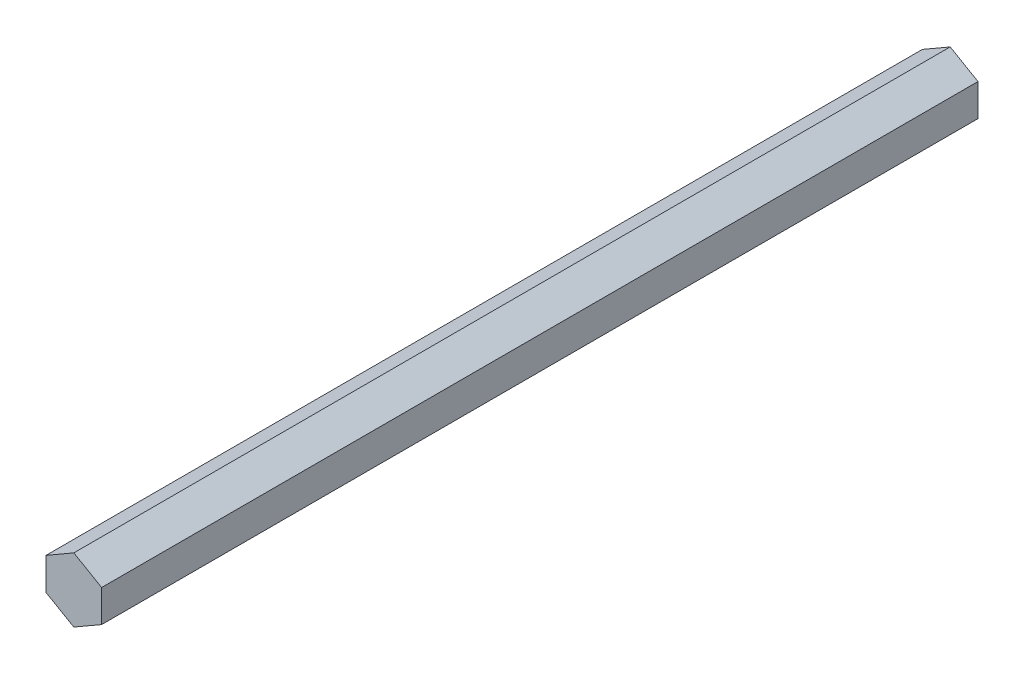
ISO-10303-21;
HEADER;
FILE_DESCRIPTION(('STEP AP214'),'2;1');
FILE_NAME('part.step','',(''),(''),'','','');
FILE_SCHEMA(('AUTOMOTIVE_DESIGN { 1 0 10303 214 1 1 1 1 }'));
ENDSEC;
DATA;
#1=APPLICATION_CONTEXT('core data for automotive mechanical design processes');
#2=APPLICATION_PROTOCOL_DEFINITION('international standard','automotive_design',2000,#1);
#3=PRODUCT_CONTEXT('',#1,'mechanical');
#4=PRODUCT('Part','Part','',(#3));
#5=PRODUCT_RELATED_PRODUCT_CATEGORY('part','',(#4));
#6=PRODUCT_DEFINITION_FORMATION('','',#4);
#7=PRODUCT_DEFINITION_CONTEXT('part definition',#1,'design');
#8=PRODUCT_DEFINITION('design','',#6,#7);
#9=PRODUCT_DEFINITION_SHAPE('','',#8);
#10=(LENGTH_UNIT() NAMED_UNIT(*) SI_UNIT(.MILLI.,.METRE.));
#11=(NAMED_UNIT(*) PLANE_ANGLE_UNIT() SI_UNIT($,.RADIAN.));
#12=(NAMED_UNIT(*) SI_UNIT($,.STERADIAN.) SOLID_ANGLE_UNIT());
#13=UNCERTAINTY_MEASURE_WITH_UNIT(LENGTH_MEASURE(1.E-05),#10,'distance_accuracy_value','');
#14=(GEOMETRIC_REPRESENTATION_CONTEXT(3) GLOBAL_UNCERTAINTY_ASSIGNED_CONTEXT((#13)) GLOBAL_UNIT_ASSIGNED_CONTEXT((#10,
#11,#12)) REPRESENTATION_CONTEXT('',''));
#15=CARTESIAN_POINT('',(0.,0.,0.));
#16=DIRECTION('',(0.,0.,1.));
#17=DIRECTION('',(1.,0.,0.));
#18=AXIS2_PLACEMENT_3D('',#15,#16,#17);
#19=CARTESIAN_POINT('',(6.35,-3.66617420935413,100.));
#20=DIRECTION('',(-1.,0.,0.));
#21=DIRECTION('',(0.,-1.,0.));
#22=AXIS2_PLACEMENT_3D('',#19,#20,#21);
#23=PLANE('',#22);
#24=DIRECTION('',(0.,1.,0.));
#25=VECTOR('',#24,1.);
#26=CARTESIAN_POINT('',(6.35,-3.66617420935413,-100.));
#27=LINE('',#26,#25);
#28=CARTESIAN_POINT('',(6.35,-3.66617420935413,-100.));
#29=VERTEX_POINT('',#28);
#30=CARTESIAN_POINT('',(6.35,3.66617420935412,-100.));
#31=VERTEX_POINT('',#30);
#32=EDGE_CURVE('E118',#29,#31,#27,.T.);
#33=ORIENTED_EDGE('',*,*,#32,.T.);
#34=DIRECTION('',(0.,0.,-1.));
#35=VECTOR('',#34,1.);
#36=CARTESIAN_POINT('',(6.35,3.66617420935412,100.));
#37=LINE('',#36,#35);
#38=CARTESIAN_POINT('',(6.35,3.66617420935412,100.));
#39=VERTEX_POINT('',#38);
#40=EDGE_CURVE('E11',#39,#31,#37,.T.);
#41=ORIENTED_EDGE('',*,*,#40,.F.);
#42=DIRECTION('',(0.,1.,0.));
#43=VECTOR('',#42,1.);
#44=CARTESIAN_POINT('',(6.35,-3.66617420935413,100.));
#45=LINE('',#44,#43);
#46=CARTESIAN_POINT('',(6.35,-3.66617420935413,100.));
#47=VERTEX_POINT('',#46);
#48=EDGE_CURVE('E128',#47,#39,#45,.T.);
#49=ORIENTED_EDGE('',*,*,#48,.F.);
#50=DIRECTION('',(0.,0.,-1.));
#51=VECTOR('',#50,1.);
#52=CARTESIAN_POINT('',(6.35,-3.66617420935413,100.));
#53=LINE('',#52,#51);
#54=EDGE_CURVE('E114',#47,#29,#53,.T.);
#55=ORIENTED_EDGE('',*,*,#54,.T.);
#56=EDGE_LOOP('',(#33,#41,#49,#55));
#57=FACE_BOUND('',#56,.T.);
#58=ADVANCED_FACE('F34',(#57),#23,.F.);
#59=CARTESIAN_POINT('',(6.35,3.66617420935412,100.));
#60=DIRECTION('',(-0.5,-0.866025403784438,0.));
#61=DIRECTION('',(0.866025403784439,-0.5,0.));
#62=AXIS2_PLACEMENT_3D('',#59,#60,#61);
#63=PLANE('',#62);
#64=DIRECTION('',(-0.866025403784438,0.5,0.));
#65=VECTOR('',#64,1.);
#66=CARTESIAN_POINT('',(6.35,3.66617420935412,-100.));
#67=LINE('',#66,#65);
#68=CARTESIAN_POINT('',(0.,7.33234841870825,-100.));
#69=VERTEX_POINT('',#68);
#70=EDGE_CURVE('E121',#31,#69,#67,.T.);
#71=ORIENTED_EDGE('',*,*,#70,.T.);
#72=DIRECTION('',(0.,0.,-1.));
#73=VECTOR('',#72,1.);
#74=CARTESIAN_POINT('',(0.,7.33234841870825,100.));
#75=LINE('',#74,#73);
#76=CARTESIAN_POINT('',(0.,7.33234841870825,100.));
#77=VERTEX_POINT('',#76);
#78=EDGE_CURVE('E42',#77,#69,#75,.T.);
#79=ORIENTED_EDGE('',*,*,#78,.F.);
#80=DIRECTION('',(-0.866025403784438,0.5,0.));
#81=VECTOR('',#80,1.);
#82=CARTESIAN_POINT('',(6.35,3.66617420935412,100.));
#83=LINE('',#82,#81);
#84=EDGE_CURVE('E87',#39,#77,#83,.T.);
#85=ORIENTED_EDGE('',*,*,#84,.F.);
#86=ORIENTED_EDGE('',*,*,#40,.T.);
#87=EDGE_LOOP('',(#71,#79,#85,#86));
#88=FACE_BOUND('',#87,.T.);
#89=ADVANCED_FACE('F152',(#88),#63,.F.);
#90=CARTESIAN_POINT('',(0.,7.33234841870825,100.));
#91=DIRECTION('',(0.499999999999999,-0.866025403784439,0.));
#92=DIRECTION('',(0.866025403784439,0.499999999999999,0.));
#93=AXIS2_PLACEMENT_3D('',#90,#91,#92);
#94=PLANE('',#93);
#95=DIRECTION('',(-0.866025403784439,-0.499999999999999,0.));
#96=VECTOR('',#95,1.);
#97=CARTESIAN_POINT('',(0.,7.33234841870825,-100.));
#98=LINE('',#97,#96);
#99=CARTESIAN_POINT('',(-6.35,3.66617420935413,-100.));
#100=VERTEX_POINT('',#99);
#101=EDGE_CURVE('E123',#69,#100,#98,.T.);
#102=ORIENTED_EDGE('',*,*,#101,.T.);
#103=DIRECTION('',(0.,0.,-1.));
#104=VECTOR('',#103,1.);
#105=CARTESIAN_POINT('',(-6.35,3.66617420935413,100.));
#106=LINE('',#105,#104);
#107=CARTESIAN_POINT('',(-6.35,3.66617420935413,100.));
#108=VERTEX_POINT('',#107);
#109=EDGE_CURVE('E109',#108,#100,#106,.T.);
#110=ORIENTED_EDGE('',*,*,#109,.F.);
#111=DIRECTION('',(-0.866025403784439,-0.499999999999999,0.));
#112=VECTOR('',#111,1.);
#113=CARTESIAN_POINT('',(0.,7.33234841870825,100.));
#114=LINE('',#113,#112);
#115=EDGE_CURVE('E100',#77,#108,#114,.T.);
#116=ORIENTED_EDGE('',*,*,#115,.F.);
#117=ORIENTED_EDGE('',*,*,#78,.T.);
#118=EDGE_LOOP('',(#102,#110,#116,#117));
#119=FACE_BOUND('',#118,.T.);
#120=ADVANCED_FACE('F134',(#119),#94,.F.);
#121=CARTESIAN_POINT('',(-6.35,3.66617420935413,100.));
#122=DIRECTION('',(1.,0.,0.));
#123=DIRECTION('',(0.,1.,0.));
#124=AXIS2_PLACEMENT_3D('',#121,#122,#123);
#125=PLANE('',#124);
#126=DIRECTION('',(0.,-1.,0.));
#127=VECTOR('',#126,1.);
#128=CARTESIAN_POINT('',(-6.35,3.66617420935413,-100.));
#129=LINE('',#128,#127);
#130=CARTESIAN_POINT('',(-6.35,-3.66617420935412,-100.));
#131=VERTEX_POINT('',#130);
#132=EDGE_CURVE('E108',#100,#131,#129,.T.);
#133=ORIENTED_EDGE('',*,*,#132,.T.);
#134=DIRECTION('',(0.,0.,-1.));
#135=VECTOR('',#134,1.);
#136=CARTESIAN_POINT('',(-6.35,-3.66617420935412,100.));
#137=LINE('',#136,#135);
#138=CARTESIAN_POINT('',(-6.35,-3.66617420935412,100.));
#139=VERTEX_POINT('',#138);
#140=EDGE_CURVE('E105',#139,#131,#137,.T.);
#141=ORIENTED_EDGE('',*,*,#140,.F.);
#142=DIRECTION('',(0.,-1.,0.));
#143=VECTOR('',#142,1.);
#144=CARTESIAN_POINT('',(-6.35,3.66617420935413,100.));
#145=LINE('',#144,#143);
#146=EDGE_CURVE('E94',#108,#139,#145,.T.);
#147=ORIENTED_EDGE('',*,*,#146,.F.);
#148=ORIENTED_EDGE('',*,*,#109,.T.);
#149=EDGE_LOOP('',(#133,#141,#147,#148));
#150=FACE_BOUND('',#149,.T.);
#151=ADVANCED_FACE('F106',(#150),#125,.F.);
#152=CARTESIAN_POINT('',(-6.35,-3.66617420935412,100.));
#153=DIRECTION('',(0.5,0.866025403784438,0.));
#154=DIRECTION('',(-0.866025403784439,0.5,0.));
#155=AXIS2_PLACEMENT_3D('',#152,#153,#154);
#156=PLANE('',#155);
#157=DIRECTION('',(0.866025403784438,-0.5,0.));
#158=VECTOR('',#157,1.);
#159=CARTESIAN_POINT('',(-6.35,-3.66617420935412,-100.));
#160=LINE('',#159,#158);
#161=CARTESIAN_POINT('',(0.,-7.33234841870825,-100.));
#162=VERTEX_POINT('',#161);
#163=EDGE_CURVE('E73',#131,#162,#160,.T.);
#164=ORIENTED_EDGE('',*,*,#163,.T.);
#165=DIRECTION('',(0.,0.,-1.));
#166=VECTOR('',#165,1.);
#167=CARTESIAN_POINT('',(0.,-7.33234841870825,100.));
#168=LINE('',#167,#166);
#169=CARTESIAN_POINT('',(0.,-7.33234841870825,100.));
#170=VERTEX_POINT('',#169);
#171=EDGE_CURVE('E110',#170,#162,#168,.T.);
#172=ORIENTED_EDGE('',*,*,#171,.F.);
#173=DIRECTION('',(0.866025403784438,-0.5,0.));
#174=VECTOR('',#173,1.);
#175=CARTESIAN_POINT('',(-6.35,-3.66617420935412,100.));
#176=LINE('',#175,#174);
#177=EDGE_CURVE('E98',#139,#170,#176,.T.);
#178=ORIENTED_EDGE('',*,*,#177,.F.);
#179=ORIENTED_EDGE('',*,*,#140,.T.);
#180=EDGE_LOOP('',(#164,#172,#178,#179));
#181=FACE_BOUND('',#180,.T.);
#182=ADVANCED_FACE('F112',(#181),#156,.F.);
#183=CARTESIAN_POINT('',(0.,-7.33234841870825,100.));
#184=DIRECTION('',(-0.499999999999999,0.866025403784439,0.));
#185=DIRECTION('',(-0.866025403784439,-0.499999999999999,0.));
#186=AXIS2_PLACEMENT_3D('',#183,#184,#185);
#187=PLANE('',#186);
#188=DIRECTION('',(0.866025403784439,0.499999999999999,0.));
#189=VECTOR('',#188,1.);
#190=CARTESIAN_POINT('',(0.,-7.33234841870825,-100.));
#191=LINE('',#190,#189);
#192=EDGE_CURVE('E79',#162,#29,#191,.T.);
#193=ORIENTED_EDGE('',*,*,#192,.T.);
#194=ORIENTED_EDGE('',*,*,#54,.F.);
#195=DIRECTION('',(0.866025403784439,0.499999999999999,0.));
#196=VECTOR('',#195,1.);
#197=CARTESIAN_POINT('',(0.,-7.33234841870825,100.));
#198=LINE('',#197,#196);
#199=EDGE_CURVE('E50',#170,#47,#198,.T.);
#200=ORIENTED_EDGE('',*,*,#199,.F.);
#201=ORIENTED_EDGE('',*,*,#171,.T.);
#202=EDGE_LOOP('',(#193,#194,#200,#201));
#203=FACE_BOUND('',#202,.T.);
#204=ADVANCED_FACE('F141',(#203),#187,.F.);
#205=CARTESIAN_POINT('',(0.,0.,100.));
#206=DIRECTION('',(0.,0.,1.));
#207=DIRECTION('',(1.,0.,0.));
#208=AXIS2_PLACEMENT_3D('',#205,#206,#207);
#209=PLANE('',#208);
#210=ORIENTED_EDGE('',*,*,#48,.T.);
#211=ORIENTED_EDGE('',*,*,#84,.T.);
#212=ORIENTED_EDGE('',*,*,#115,.T.);
#213=ORIENTED_EDGE('',*,*,#146,.T.);
#214=ORIENTED_EDGE('',*,*,#177,.T.);
#215=ORIENTED_EDGE('',*,*,#199,.T.);
#216=EDGE_LOOP('',(#210,#211,#212,#213,#214,#215));
#217=FACE_BOUND('',#216,.T.);
#218=ADVANCED_FACE('F96',(#217),#209,.T.);
#219=CARTESIAN_POINT('',(0.,0.,-100.));
#220=DIRECTION('',(0.,0.,1.));
#221=DIRECTION('',(1.,0.,0.));
#222=AXIS2_PLACEMENT_3D('',#219,#220,#221);
#223=PLANE('',#222);
#224=ORIENTED_EDGE('',*,*,#32,.F.);
#225=ORIENTED_EDGE('',*,*,#192,.F.);
#226=ORIENTED_EDGE('',*,*,#163,.F.);
#227=ORIENTED_EDGE('',*,*,#132,.F.);
#228=ORIENTED_EDGE('',*,*,#101,.F.);
#229=ORIENTED_EDGE('',*,*,#70,.F.);
#230=EDGE_LOOP('',(#224,#225,#226,#227,#228,#229));
#231=FACE_BOUND('',#230,.T.);
#232=ADVANCED_FACE('F137',(#231),#223,.F.);
#233=CLOSED_SHELL('',(#58,#89,#120,#151,#182,#204,#218,#232));
#234=MANIFOLD_SOLID_BREP('B2',#233);
#235=ADVANCED_BREP_SHAPE_REPRESENTATION('',(#18,#234),#14);
#236=SHAPE_DEFINITION_REPRESENTATION(#9,#235);
ENDSEC;
END-ISO-10303-21;
